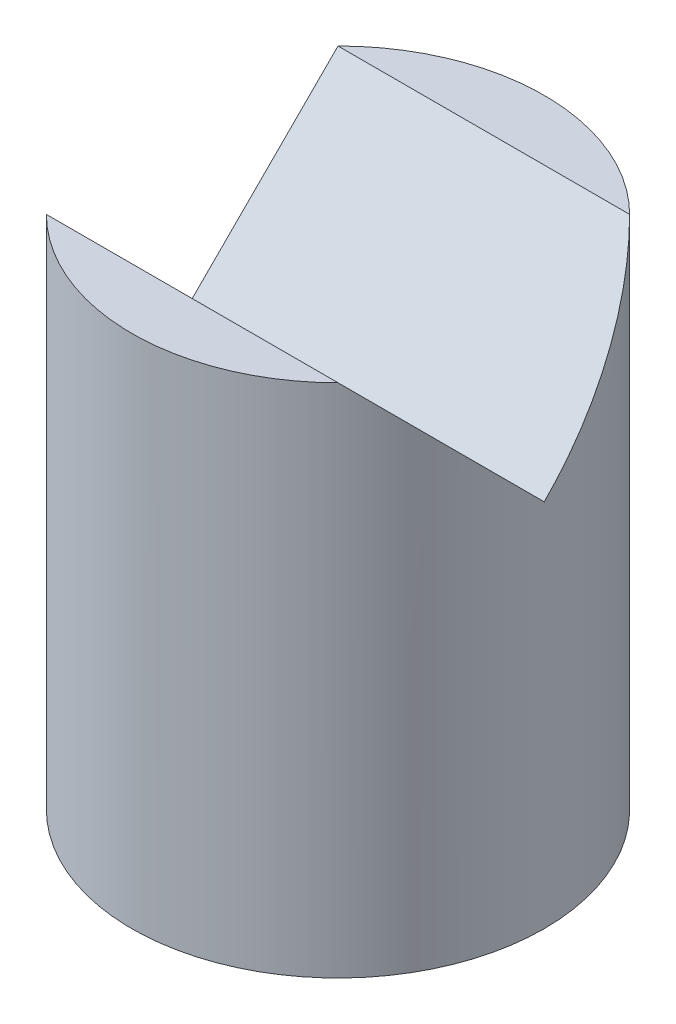
ISO-10303-21;
HEADER;
FILE_DESCRIPTION(('STEP AP214'),'2;1');
FILE_NAME('part.step','',(''),(''),'','','');
FILE_SCHEMA(('AUTOMOTIVE_DESIGN { 1 0 10303 214 1 1 1 1 }'));
ENDSEC;
DATA;
#1=APPLICATION_CONTEXT('core data for automotive mechanical design processes');
#2=APPLICATION_PROTOCOL_DEFINITION('international standard','automotive_design',2000,#1);
#3=PRODUCT_CONTEXT('',#1,'mechanical');
#4=PRODUCT('Part','Part','',(#3));
#5=PRODUCT_RELATED_PRODUCT_CATEGORY('part','',(#4));
#6=PRODUCT_DEFINITION_FORMATION('','',#4);
#7=PRODUCT_DEFINITION_CONTEXT('part definition',#1,'design');
#8=PRODUCT_DEFINITION('design','',#6,#7);
#9=PRODUCT_DEFINITION_SHAPE('','',#8);
#10=(LENGTH_UNIT() NAMED_UNIT(*) SI_UNIT(.MILLI.,.METRE.));
#11=(NAMED_UNIT(*) PLANE_ANGLE_UNIT() SI_UNIT($,.RADIAN.));
#12=(NAMED_UNIT(*) SI_UNIT($,.STERADIAN.) SOLID_ANGLE_UNIT());
#13=UNCERTAINTY_MEASURE_WITH_UNIT(LENGTH_MEASURE(1.E-05),#10,'distance_accuracy_value','');
#14=(GEOMETRIC_REPRESENTATION_CONTEXT(3) GLOBAL_UNCERTAINTY_ASSIGNED_CONTEXT((#13)) GLOBAL_UNIT_ASSIGNED_CONTEXT((#10,
#11,#12)) REPRESENTATION_CONTEXT('',''));
#15=CARTESIAN_POINT('',(0.,0.,0.));
#16=DIRECTION('',(0.,0.,1.));
#17=DIRECTION('',(1.,0.,0.));
#18=AXIS2_PLACEMENT_3D('',#15,#16,#17);
#19=CARTESIAN_POINT('',(0.,10.,0.));
#20=DIRECTION('',(0.,-1.,0.));
#21=DIRECTION('',(0.,0.,-1.));
#22=AXIS2_PLACEMENT_3D('',#19,#20,#21);
#23=PLANE('',#22);
#24=CARTESIAN_POINT('',(0.,10.,0.));
#25=DIRECTION('',(0.,1.,0.));
#26=DIRECTION('',(0.,0.,-1.));
#27=AXIS2_PLACEMENT_3D('',#24,#25,#26);
#28=CIRCLE('',#27,4.);
#29=CARTESIAN_POINT('',(-2.82842712474618,10.,2.8284271247462));
#30=VERTEX_POINT('',#29);
#31=CARTESIAN_POINT('',(2.82842712474618,10.,2.8284271247462));
#32=VERTEX_POINT('',#31);
#33=EDGE_CURVE('E101',#30,#32,#28,.T.);
#34=ORIENTED_EDGE('',*,*,#33,.T.);
#35=DIRECTION('',(-1.,0.,0.));
#36=VECTOR('',#35,1.);
#37=CARTESIAN_POINT('',(4.001,10.,2.8284271247462));
#38=LINE('',#37,#36);
#39=EDGE_CURVE('E108',#32,#30,#38,.T.);
#40=ORIENTED_EDGE('',*,*,#39,.T.);
#41=EDGE_LOOP('',(#34,#40));
#42=FACE_BOUND('',#41,.T.);
#43=ADVANCED_FACE('F41',(#42),#23,.F.);
#44=CARTESIAN_POINT('',(0.,10.,0.));
#45=DIRECTION('',(0.,-1.,0.));
#46=DIRECTION('',(0.,0.,-1.));
#47=AXIS2_PLACEMENT_3D('',#44,#45,#46);
#48=CYLINDRICAL_SURFACE('',#47,4.);
#49=CARTESIAN_POINT('',(0.,7.17157287525381,0.));
#50=DIRECTION('',(0.,-0.707106781186548,-0.707106781186547));
#51=DIRECTION('',(0.,-0.707106781186547,0.707106781186548));
#52=AXIS2_PLACEMENT_3D('',#49,#50,#51);
#53=ELLIPSE('',#52,5.65685424949238,4.);
#54=CARTESIAN_POINT('',(4.,7.17157287525381,0.));
#55=VERTEX_POINT('',#54);
#56=CARTESIAN_POINT('',(2.82842712474618,10.,-2.8284271247462));
#57=VERTEX_POINT('',#56);
#58=EDGE_CURVE('E58',#55,#57,#53,.F.);
#59=ORIENTED_EDGE('',*,*,#58,.F.);
#60=CARTESIAN_POINT('',(0.,7.17157287525381,0.));
#61=DIRECTION('',(0.,-0.707106781186548,0.707106781186547));
#62=DIRECTION('',(0.,-0.707106781186547,-0.707106781186548));
#63=AXIS2_PLACEMENT_3D('',#60,#61,#62);
#64=ELLIPSE('',#63,5.65685424949238,4.);
#65=EDGE_CURVE('E96',#32,#55,#64,.F.);
#66=ORIENTED_EDGE('',*,*,#65,.F.);
#67=ORIENTED_EDGE('',*,*,#33,.F.);
#68=DIRECTION('',(0.,-1.,0.));
#69=VECTOR('',#68,1.);
#70=CARTESIAN_POINT('',(-2.82842712474618,10.,2.8284271247462));
#71=LINE('',#70,#69);
#72=CARTESIAN_POINT('',(-2.82842712474618,0.,2.8284271247462));
#73=VERTEX_POINT('',#72);
#74=EDGE_CURVE('E50',#30,#73,#71,.T.);
#75=ORIENTED_EDGE('',*,*,#74,.T.);
#76=CARTESIAN_POINT('',(0.,0.,0.));
#77=DIRECTION('',(0.,1.,0.));
#78=DIRECTION('',(0.,0.,-1.));
#79=AXIS2_PLACEMENT_3D('',#76,#77,#78);
#80=CIRCLE('',#79,4.);
#81=CARTESIAN_POINT('',(-2.82842712474618,0.,-2.8284271247462));
#82=VERTEX_POINT('',#81);
#83=EDGE_CURVE('E104',#73,#82,#80,.T.);
#84=ORIENTED_EDGE('',*,*,#83,.T.);
#85=DIRECTION('',(0.,-1.,0.));
#86=VECTOR('',#85,1.);
#87=CARTESIAN_POINT('',(-2.82842712474618,10.,-2.8284271247462));
#88=LINE('',#87,#86);
#89=CARTESIAN_POINT('',(-2.82842712474618,10.,-2.8284271247462));
#90=VERTEX_POINT('',#89);
#91=EDGE_CURVE('E12',#90,#82,#88,.T.);
#92=ORIENTED_EDGE('',*,*,#91,.F.);
#93=EDGE_CURVE('E98',#57,#90,#28,.T.);
#94=ORIENTED_EDGE('',*,*,#93,.F.);
#95=EDGE_LOOP('',(#59,#66,#67,#75,#84,#92,#94));
#96=FACE_BOUND('',#95,.T.);
#97=ADVANCED_FACE('F43',(#96),#48,.T.);
#98=CARTESIAN_POINT('',(-2.82842712474618,10.,-2.8284271247462));
#99=DIRECTION('',(1.,0.,0.));
#100=DIRECTION('',(0.,0.,-1.));
#101=AXIS2_PLACEMENT_3D('',#98,#99,#100);
#102=PLANE('',#101);
#103=ORIENTED_EDGE('',*,*,#74,.F.);
#104=DIRECTION('',(0.,0.707106781186547,0.707106781186548));
#105=VECTOR('',#104,1.);
#106=CARTESIAN_POINT('',(-2.82842712474618,7.17157287525381,0.));
#107=LINE('',#106,#105);
#108=CARTESIAN_POINT('',(-2.82842712474618,7.17157287525381,0.));
#109=VERTEX_POINT('',#108);
#110=EDGE_CURVE('E91',#109,#30,#107,.T.);
#111=ORIENTED_EDGE('',*,*,#110,.F.);
#112=DIRECTION('',(0.,-0.707106781186547,0.707106781186548));
#113=VECTOR('',#112,1.);
#114=CARTESIAN_POINT('',(-2.82842712474618,10.,-2.8284271247462));
#115=LINE('',#114,#113);
#116=EDGE_CURVE('E85',#90,#109,#115,.T.);
#117=ORIENTED_EDGE('',*,*,#116,.F.);
#118=ORIENTED_EDGE('',*,*,#91,.T.);
#119=DIRECTION('',(0.,0.,1.));
#120=VECTOR('',#119,1.);
#121=CARTESIAN_POINT('',(-2.82842712474618,0.,-2.8284271247462));
#122=LINE('',#121,#120);
#123=EDGE_CURVE('E65',#82,#73,#122,.T.);
#124=ORIENTED_EDGE('',*,*,#123,.T.);
#125=EDGE_LOOP('',(#103,#111,#117,#118,#124));
#126=FACE_BOUND('',#125,.T.);
#127=ADVANCED_FACE('F93',(#126),#102,.F.);
#128=ORIENTED_EDGE('',*,*,#93,.T.);
#129=DIRECTION('',(-1.,0.,0.));
#130=VECTOR('',#129,1.);
#131=CARTESIAN_POINT('',(4.001,10.,-2.8284271247462));
#132=LINE('',#131,#130);
#133=EDGE_CURVE('E82',#57,#90,#132,.T.);
#134=ORIENTED_EDGE('',*,*,#133,.F.);
#135=EDGE_LOOP('',(#128,#134));
#136=FACE_BOUND('',#135,.T.);
#137=ADVANCED_FACE('F99',(#136),#23,.F.);
#138=CARTESIAN_POINT('',(0.,0.,0.));
#139=DIRECTION('',(0.,-1.,0.));
#140=DIRECTION('',(0.,0.,-1.));
#141=AXIS2_PLACEMENT_3D('',#138,#139,#140);
#142=PLANE('',#141);
#143=ORIENTED_EDGE('',*,*,#83,.F.);
#144=ORIENTED_EDGE('',*,*,#123,.F.);
#145=EDGE_LOOP('',(#143,#144));
#146=FACE_BOUND('',#145,.T.);
#147=ADVANCED_FACE('F141',(#146),#142,.T.);
#148=CARTESIAN_POINT('',(4.001,7.17157287525381,0.));
#149=DIRECTION('',(0.,-0.707106781186548,0.707106781186547));
#150=DIRECTION('',(0.,-0.707106781186547,-0.707106781186548));
#151=AXIS2_PLACEMENT_3D('',#148,#149,#150);
#152=PLANE('',#151);
#153=ORIENTED_EDGE('',*,*,#65,.T.);
#154=DIRECTION('',(-1.,0.,0.));
#155=VECTOR('',#154,1.);
#156=CARTESIAN_POINT('',(4.001,7.17157287525381,0.));
#157=LINE('',#156,#155);
#158=EDGE_CURVE('E90',#55,#109,#157,.T.);
#159=ORIENTED_EDGE('',*,*,#158,.T.);
#160=ORIENTED_EDGE('',*,*,#110,.T.);
#161=ORIENTED_EDGE('',*,*,#39,.F.);
#162=EDGE_LOOP('',(#153,#159,#160,#161));
#163=FACE_BOUND('',#162,.T.);
#164=ADVANCED_FACE('F131',(#163),#152,.F.);
#165=CARTESIAN_POINT('',(4.001,10.,-2.8284271247462));
#166=DIRECTION('',(0.,-0.707106781186548,-0.707106781186547));
#167=DIRECTION('',(0.,0.707106781186547,-0.707106781186548));
#168=AXIS2_PLACEMENT_3D('',#165,#166,#167);
#169=PLANE('',#168);
#170=ORIENTED_EDGE('',*,*,#58,.T.);
#171=ORIENTED_EDGE('',*,*,#133,.T.);
#172=ORIENTED_EDGE('',*,*,#116,.T.);
#173=ORIENTED_EDGE('',*,*,#158,.F.);
#174=EDGE_LOOP('',(#170,#171,#172,#173));
#175=FACE_BOUND('',#174,.T.);
#176=ADVANCED_FACE('F84',(#175),#169,.F.);
#177=CLOSED_SHELL('',(#43,#97,#127,#137,#147,#164,#176));
#178=MANIFOLD_SOLID_BREP('B2',#177);
#179=ADVANCED_BREP_SHAPE_REPRESENTATION('',(#18,#178),#14);
#180=SHAPE_DEFINITION_REPRESENTATION(#9,#179);
ENDSEC;
END-ISO-10303-21;
